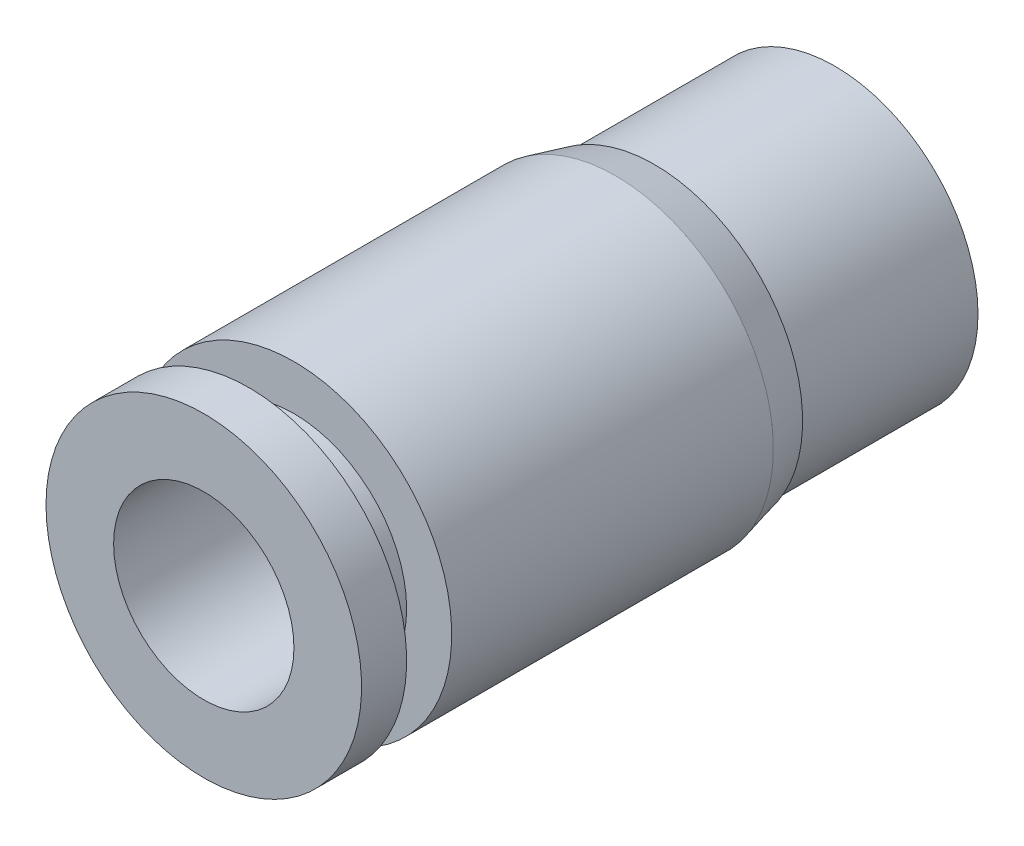
ISO-10303-21;
HEADER;
FILE_DESCRIPTION(('STEP AP214'),'2;1');
FILE_NAME('part.step','',(''),(''),'','','');
FILE_SCHEMA(('AUTOMOTIVE_DESIGN { 1 0 10303 214 1 1 1 1 }'));
ENDSEC;
DATA;
#1=APPLICATION_CONTEXT('core data for automotive mechanical design processes');
#2=APPLICATION_PROTOCOL_DEFINITION('international standard','automotive_design',2000,#1);
#3=PRODUCT_CONTEXT('',#1,'mechanical');
#4=PRODUCT('Part','Part','',(#3));
#5=PRODUCT_RELATED_PRODUCT_CATEGORY('part','',(#4));
#6=PRODUCT_DEFINITION_FORMATION('','',#4);
#7=PRODUCT_DEFINITION_CONTEXT('part definition',#1,'design');
#8=PRODUCT_DEFINITION('design','',#6,#7);
#9=PRODUCT_DEFINITION_SHAPE('','',#8);
#10=(LENGTH_UNIT() NAMED_UNIT(*) SI_UNIT(.MILLI.,.METRE.));
#11=(NAMED_UNIT(*) PLANE_ANGLE_UNIT() SI_UNIT($,.RADIAN.));
#12=(NAMED_UNIT(*) SI_UNIT($,.STERADIAN.) SOLID_ANGLE_UNIT());
#13=UNCERTAINTY_MEASURE_WITH_UNIT(LENGTH_MEASURE(1.E-05),#10,'distance_accuracy_value','');
#14=(GEOMETRIC_REPRESENTATION_CONTEXT(3) GLOBAL_UNCERTAINTY_ASSIGNED_CONTEXT((#13)) GLOBAL_UNIT_ASSIGNED_CONTEXT((#10,
#11,#12)) REPRESENTATION_CONTEXT('',''));
#15=CARTESIAN_POINT('',(0.,0.,0.));
#16=DIRECTION('',(0.,0.,1.));
#17=DIRECTION('',(1.,0.,0.));
#18=AXIS2_PLACEMENT_3D('',#15,#16,#17);
#19=CARTESIAN_POINT('',(0.,2.,2.));
#20=DIRECTION('',(0.,0.,1.));
#21=DIRECTION('',(1.,0.,0.));
#22=AXIS2_PLACEMENT_3D('',#19,#20,#21);
#23=PLANE('',#22);
#24=CARTESIAN_POINT('',(0.,0.,2.));
#25=DIRECTION('',(0.,0.,-1.));
#26=DIRECTION('',(-1.,0.,0.));
#27=AXIS2_PLACEMENT_3D('',#24,#25,#26);
#28=CIRCLE('',#27,1.8547069881859);
#29=CARTESIAN_POINT('',(-1.8547069881859,0.,2.));
#30=VERTEX_POINT('',#29);
#31=EDGE_CURVE('E10',#30,#30,#28,.T.);
#32=ORIENTED_EDGE('',*,*,#31,.T.);
#33=EDGE_LOOP('',(#32));
#34=FACE_BOUND('',#33,.T.);
#35=CARTESIAN_POINT('',(0.,0.,2.));
#36=DIRECTION('',(0.,0.,-1.));
#37=DIRECTION('',(-1.,0.,0.));
#38=AXIS2_PLACEMENT_3D('',#35,#36,#37);
#39=CIRCLE('',#38,2.);
#40=CARTESIAN_POINT('',(-2.,0.,2.));
#41=VERTEX_POINT('',#40);
#42=EDGE_CURVE('E72',#41,#41,#39,.T.);
#43=ORIENTED_EDGE('',*,*,#42,.F.);
#44=EDGE_LOOP('',(#43));
#45=FACE_BOUND('',#44,.T.);
#46=ADVANCED_FACE('F29',(#34,#45),#23,.T.);
#47=CARTESIAN_POINT('',(0.,0.,-4.7));
#48=DIRECTION('',(0.,0.,-1.));
#49=DIRECTION('',(-1.,0.,0.));
#50=AXIS2_PLACEMENT_3D('',#47,#48,#49);
#51=CYLINDRICAL_SURFACE('',#50,1.8547069881859);
#52=CARTESIAN_POINT('',(0.,0.,-4.));
#53=DIRECTION('',(0.,0.,-1.));
#54=DIRECTION('',(-1.,0.,0.));
#55=AXIS2_PLACEMENT_3D('',#52,#53,#54);
#56=CIRCLE('',#55,1.8547069881859);
#57=CARTESIAN_POINT('',(-1.8547069881859,0.,-4.));
#58=VERTEX_POINT('',#57);
#59=EDGE_CURVE('E35',#58,#58,#56,.T.);
#60=ORIENTED_EDGE('',*,*,#59,.T.);
#61=EDGE_LOOP('',(#60));
#62=FACE_BOUND('',#61,.T.);
#63=ORIENTED_EDGE('',*,*,#31,.F.);
#64=EDGE_LOOP('',(#63));
#65=FACE_BOUND('',#64,.T.);
#66=ADVANCED_FACE('F80',(#62,#65),#51,.F.);
#67=CARTESIAN_POINT('',(0.,1.8547069881859,-4.));
#68=DIRECTION('',(0.,0.,-1.));
#69=DIRECTION('',(-1.,0.,0.));
#70=AXIS2_PLACEMENT_3D('',#67,#68,#69);
#71=PLANE('',#70);
#72=CARTESIAN_POINT('',(0.,0.,-4.));
#73=DIRECTION('',(0.,0.,-1.));
#74=DIRECTION('',(-1.,0.,0.));
#75=AXIS2_PLACEMENT_3D('',#72,#73,#74);
#76=CIRCLE('',#75,3.175);
#77=CARTESIAN_POINT('',(-3.175,0.,-4.));
#78=VERTEX_POINT('',#77);
#79=EDGE_CURVE('E39',#78,#78,#76,.T.);
#80=ORIENTED_EDGE('',*,*,#79,.T.);
#81=EDGE_LOOP('',(#80));
#82=FACE_BOUND('',#81,.T.);
#83=ORIENTED_EDGE('',*,*,#59,.F.);
#84=EDGE_LOOP('',(#83));
#85=FACE_BOUND('',#84,.T.);
#86=ADVANCED_FACE('F84',(#82,#85),#71,.T.);
#87=CARTESIAN_POINT('',(0.,0.,-4.7));
#88=DIRECTION('',(0.,0.,-1.));
#89=DIRECTION('',(-1.,0.,0.));
#90=AXIS2_PLACEMENT_3D('',#87,#88,#89);
#91=CYLINDRICAL_SURFACE('',#90,3.175);
#92=CARTESIAN_POINT('',(0.,0.,0.));
#93=DIRECTION('',(0.,0.,-1.));
#94=DIRECTION('',(-1.,0.,0.));
#95=AXIS2_PLACEMENT_3D('',#92,#93,#94);
#96=CIRCLE('',#95,3.175);
#97=CARTESIAN_POINT('',(-3.175,0.,0.));
#98=VERTEX_POINT('',#97);
#99=EDGE_CURVE('E43',#98,#98,#96,.T.);
#100=ORIENTED_EDGE('',*,*,#99,.T.);
#101=EDGE_LOOP('',(#100));
#102=FACE_BOUND('',#101,.T.);
#103=ORIENTED_EDGE('',*,*,#79,.F.);
#104=EDGE_LOOP('',(#103));
#105=FACE_BOUND('',#104,.T.);
#106=ADVANCED_FACE('F88',(#102,#105),#91,.T.);
#107=CARTESIAN_POINT('',(0.,3.28394528246303,0.));
#108=DIRECTION('',(0.,0.,-1.));
#109=DIRECTION('',(-1.,0.,0.));
#110=AXIS2_PLACEMENT_3D('',#107,#108,#109);
#111=PLANE('',#110);
#112=CARTESIAN_POINT('',(0.,0.,0.));
#113=DIRECTION('',(0.,0.,-1.));
#114=DIRECTION('',(-1.,0.,0.));
#115=AXIS2_PLACEMENT_3D('',#112,#113,#114);
#116=CIRCLE('',#115,3.28394528246303);
#117=CARTESIAN_POINT('',(-3.28394528246303,0.,0.));
#118=VERTEX_POINT('',#117);
#119=EDGE_CURVE('E48',#118,#118,#116,.T.);
#120=ORIENTED_EDGE('',*,*,#119,.T.);
#121=EDGE_LOOP('',(#120));
#122=FACE_BOUND('',#121,.T.);
#123=ORIENTED_EDGE('',*,*,#99,.F.);
#124=EDGE_LOOP('',(#123));
#125=FACE_BOUND('',#124,.T.);
#126=ADVANCED_FACE('F95',(#122,#125),#111,.T.);
#127=CARTESIAN_POINT('',(0.,0.,0.));
#128=DIRECTION('',(0.,0.,1.));
#129=DIRECTION('',(1.,0.,0.));
#130=AXIS2_PLACEMENT_3D('',#127,#128,#129);
#131=CONICAL_SURFACE('',#130,3.28394528246303,0.244978663126864);
#132=CARTESIAN_POINT('',(0.,0.,0.864218870147883));
#133=DIRECTION('',(0.,0.,-1.));
#134=DIRECTION('',(-1.,0.,0.));
#135=AXIS2_PLACEMENT_3D('',#132,#133,#134);
#136=CIRCLE('',#135,3.5);
#137=CARTESIAN_POINT('',(-3.5,0.,0.864218870147883));
#138=VERTEX_POINT('',#137);
#139=EDGE_CURVE('E51',#138,#138,#136,.T.);
#140=ORIENTED_EDGE('',*,*,#139,.T.);
#141=EDGE_LOOP('',(#140));
#142=FACE_BOUND('',#141,.T.);
#143=ORIENTED_EDGE('',*,*,#119,.F.);
#144=EDGE_LOOP('',(#143));
#145=FACE_BOUND('',#144,.T.);
#146=ADVANCED_FACE('F99',(#142,#145),#131,.T.);
#147=CARTESIAN_POINT('',(0.,0.,-4.7));
#148=DIRECTION('',(0.,0.,-1.));
#149=DIRECTION('',(-1.,0.,0.));
#150=AXIS2_PLACEMENT_3D('',#147,#148,#149);
#151=CYLINDRICAL_SURFACE('',#150,3.5);
#152=CARTESIAN_POINT('',(0.,0.,8.));
#153=DIRECTION('',(0.,0.,-1.));
#154=DIRECTION('',(-1.,0.,0.));
#155=AXIS2_PLACEMENT_3D('',#152,#153,#154);
#156=CIRCLE('',#155,3.5);
#157=CARTESIAN_POINT('',(-3.5,0.,8.));
#158=VERTEX_POINT('',#157);
#159=EDGE_CURVE('E54',#158,#158,#156,.T.);
#160=ORIENTED_EDGE('',*,*,#159,.T.);
#161=EDGE_LOOP('',(#160));
#162=FACE_BOUND('',#161,.T.);
#163=ORIENTED_EDGE('',*,*,#139,.F.);
#164=EDGE_LOOP('',(#163));
#165=FACE_BOUND('',#164,.T.);
#166=ADVANCED_FACE('F103',(#162,#165),#151,.T.);
#167=CARTESIAN_POINT('',(0.,2.5,8.));
#168=DIRECTION('',(0.,0.,1.));
#169=DIRECTION('',(1.,0.,0.));
#170=AXIS2_PLACEMENT_3D('',#167,#168,#169);
#171=PLANE('',#170);
#172=CARTESIAN_POINT('',(0.,0.,8.));
#173=DIRECTION('',(0.,0.,-1.));
#174=DIRECTION('',(-1.,0.,0.));
#175=AXIS2_PLACEMENT_3D('',#172,#173,#174);
#176=CIRCLE('',#175,2.5);
#177=CARTESIAN_POINT('',(-2.5,0.,8.));
#178=VERTEX_POINT('',#177);
#179=EDGE_CURVE('E57',#178,#178,#176,.T.);
#180=ORIENTED_EDGE('',*,*,#179,.T.);
#181=EDGE_LOOP('',(#180));
#182=FACE_BOUND('',#181,.T.);
#183=ORIENTED_EDGE('',*,*,#159,.F.);
#184=EDGE_LOOP('',(#183));
#185=FACE_BOUND('',#184,.T.);
#186=ADVANCED_FACE('F107',(#182,#185),#171,.T.);
#187=CARTESIAN_POINT('',(0.,0.,-4.7));
#188=DIRECTION('',(0.,0.,-1.));
#189=DIRECTION('',(-1.,0.,0.));
#190=AXIS2_PLACEMENT_3D('',#187,#188,#189);
#191=CYLINDRICAL_SURFACE('',#190,2.5);
#192=CARTESIAN_POINT('',(0.,0.,9.));
#193=DIRECTION('',(0.,0.,-1.));
#194=DIRECTION('',(-1.,0.,0.));
#195=AXIS2_PLACEMENT_3D('',#192,#193,#194);
#196=CIRCLE('',#195,2.5);
#197=CARTESIAN_POINT('',(-2.5,0.,9.));
#198=VERTEX_POINT('',#197);
#199=EDGE_CURVE('E60',#198,#198,#196,.T.);
#200=ORIENTED_EDGE('',*,*,#199,.T.);
#201=EDGE_LOOP('',(#200));
#202=FACE_BOUND('',#201,.T.);
#203=ORIENTED_EDGE('',*,*,#179,.F.);
#204=EDGE_LOOP('',(#203));
#205=FACE_BOUND('',#204,.T.);
#206=ADVANCED_FACE('F111',(#202,#205),#191,.T.);
#207=CARTESIAN_POINT('',(0.,3.5,9.));
#208=DIRECTION('',(0.,0.,-1.));
#209=DIRECTION('',(-1.,0.,0.));
#210=AXIS2_PLACEMENT_3D('',#207,#208,#209);
#211=PLANE('',#210);
#212=CARTESIAN_POINT('',(0.,0.,9.));
#213=DIRECTION('',(0.,0.,-1.));
#214=DIRECTION('',(-1.,0.,0.));
#215=AXIS2_PLACEMENT_3D('',#212,#213,#214);
#216=CIRCLE('',#215,3.5);
#217=CARTESIAN_POINT('',(-3.5,0.,9.));
#218=VERTEX_POINT('',#217);
#219=EDGE_CURVE('E63',#218,#218,#216,.T.);
#220=ORIENTED_EDGE('',*,*,#219,.T.);
#221=EDGE_LOOP('',(#220));
#222=FACE_BOUND('',#221,.T.);
#223=ORIENTED_EDGE('',*,*,#199,.F.);
#224=EDGE_LOOP('',(#223));
#225=FACE_BOUND('',#224,.T.);
#226=ADVANCED_FACE('F115',(#222,#225),#211,.T.);
#227=CARTESIAN_POINT('',(0.,0.,-4.7));
#228=DIRECTION('',(0.,0.,-1.));
#229=DIRECTION('',(-1.,0.,0.));
#230=AXIS2_PLACEMENT_3D('',#227,#228,#229);
#231=CYLINDRICAL_SURFACE('',#230,3.5);
#232=CARTESIAN_POINT('',(0.,0.,10.));
#233=DIRECTION('',(0.,0.,-1.));
#234=DIRECTION('',(-1.,0.,0.));
#235=AXIS2_PLACEMENT_3D('',#232,#233,#234);
#236=CIRCLE('',#235,3.5);
#237=CARTESIAN_POINT('',(-3.5,0.,10.));
#238=VERTEX_POINT('',#237);
#239=EDGE_CURVE('E66',#238,#238,#236,.T.);
#240=ORIENTED_EDGE('',*,*,#239,.T.);
#241=EDGE_LOOP('',(#240));
#242=FACE_BOUND('',#241,.T.);
#243=ORIENTED_EDGE('',*,*,#219,.F.);
#244=EDGE_LOOP('',(#243));
#245=FACE_BOUND('',#244,.T.);
#246=ADVANCED_FACE('F119',(#242,#245),#231,.T.);
#247=CARTESIAN_POINT('',(0.,2.,10.));
#248=DIRECTION('',(0.,0.,1.));
#249=DIRECTION('',(1.,0.,0.));
#250=AXIS2_PLACEMENT_3D('',#247,#248,#249);
#251=PLANE('',#250);
#252=CARTESIAN_POINT('',(0.,0.,10.));
#253=DIRECTION('',(0.,0.,-1.));
#254=DIRECTION('',(-1.,0.,0.));
#255=AXIS2_PLACEMENT_3D('',#252,#253,#254);
#256=CIRCLE('',#255,2.);
#257=CARTESIAN_POINT('',(-2.,0.,10.));
#258=VERTEX_POINT('',#257);
#259=EDGE_CURVE('E69',#258,#258,#256,.T.);
#260=ORIENTED_EDGE('',*,*,#259,.T.);
#261=EDGE_LOOP('',(#260));
#262=FACE_BOUND('',#261,.T.);
#263=ORIENTED_EDGE('',*,*,#239,.F.);
#264=EDGE_LOOP('',(#263));
#265=FACE_BOUND('',#264,.T.);
#266=ADVANCED_FACE('F123',(#262,#265),#251,.T.);
#267=CARTESIAN_POINT('',(0.,0.,-4.7));
#268=DIRECTION('',(0.,0.,-1.));
#269=DIRECTION('',(-1.,0.,0.));
#270=AXIS2_PLACEMENT_3D('',#267,#268,#269);
#271=CYLINDRICAL_SURFACE('',#270,2.);
#272=ORIENTED_EDGE('',*,*,#42,.T.);
#273=EDGE_LOOP('',(#272));
#274=FACE_BOUND('',#273,.T.);
#275=ORIENTED_EDGE('',*,*,#259,.F.);
#276=EDGE_LOOP('',(#275));
#277=FACE_BOUND('',#276,.T.);
#278=ADVANCED_FACE('F76',(#274,#277),#271,.F.);
#279=CLOSED_SHELL('',(#46,#66,#86,#106,#126,#146,#166,#186,#206,#226,#246,#266,#278));
#280=MANIFOLD_SOLID_BREP('B2',#279);
#281=ADVANCED_BREP_SHAPE_REPRESENTATION('',(#18,#280),#14);
#282=SHAPE_DEFINITION_REPRESENTATION(#9,#281);
ENDSEC;
END-ISO-10303-21;
